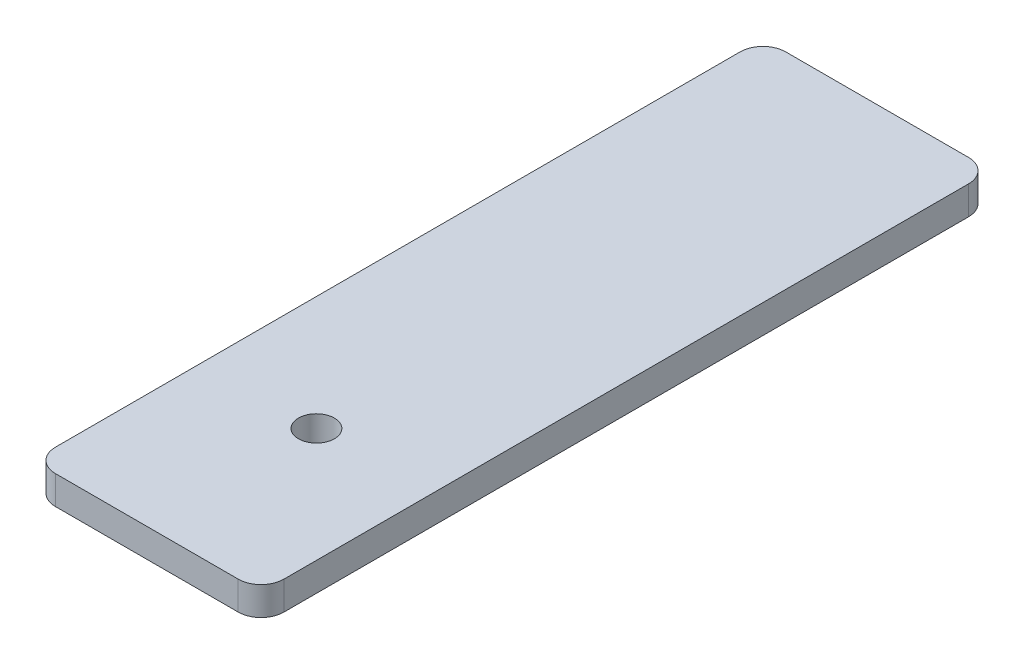
ISO-10303-21;
HEADER;
FILE_DESCRIPTION(('STEP AP214'),'2;1');
FILE_NAME('part.step','',(''),(''),'','','');
FILE_SCHEMA(('AUTOMOTIVE_DESIGN { 1 0 10303 214 1 1 1 1 }'));
ENDSEC;
DATA;
#1=APPLICATION_CONTEXT('core data for automotive mechanical design processes');
#2=APPLICATION_PROTOCOL_DEFINITION('international standard','automotive_design',2000,#1);
#3=PRODUCT_CONTEXT('',#1,'mechanical');
#4=PRODUCT('Part','Part','',(#3));
#5=PRODUCT_RELATED_PRODUCT_CATEGORY('part','',(#4));
#6=PRODUCT_DEFINITION_FORMATION('','',#4);
#7=PRODUCT_DEFINITION_CONTEXT('part definition',#1,'design');
#8=PRODUCT_DEFINITION('design','',#6,#7);
#9=PRODUCT_DEFINITION_SHAPE('','',#8);
#10=(LENGTH_UNIT() NAMED_UNIT(*) SI_UNIT(.MILLI.,.METRE.));
#11=(NAMED_UNIT(*) PLANE_ANGLE_UNIT() SI_UNIT($,.RADIAN.));
#12=(NAMED_UNIT(*) SI_UNIT($,.STERADIAN.) SOLID_ANGLE_UNIT());
#13=UNCERTAINTY_MEASURE_WITH_UNIT(LENGTH_MEASURE(1.E-05),#10,'distance_accuracy_value','');
#14=(GEOMETRIC_REPRESENTATION_CONTEXT(3) GLOBAL_UNCERTAINTY_ASSIGNED_CONTEXT((#13)) GLOBAL_UNIT_ASSIGNED_CONTEXT((#10,
#11,#12)) REPRESENTATION_CONTEXT('',''));
#15=CARTESIAN_POINT('',(0.,0.,0.));
#16=DIRECTION('',(0.,0.,1.));
#17=DIRECTION('',(1.,0.,0.));
#18=AXIS2_PLACEMENT_3D('',#15,#16,#17);
#19=CARTESIAN_POINT('',(-26.2810810810811,3.175,24.9587837837838));
#20=DIRECTION('',(1.,0.,0.));
#21=DIRECTION('',(0.,0.,-1.));
#22=AXIS2_PLACEMENT_3D('',#19,#20,#21);
#23=PLANE('',#22);
#24=DIRECTION('',(0.,0.,1.));
#25=VECTOR('',#24,1.);
#26=CARTESIAN_POINT('',(-26.2810810810811,3.175,24.9587837837838));
#27=LINE('',#26,#25);
#28=CARTESIAN_POINT('',(-26.2810810810811,3.175,-53.6762162162162));
#29=VERTEX_POINT('',#28);
#30=CARTESIAN_POINT('',(-26.2810810810811,3.175,22.4187837837838));
#31=VERTEX_POINT('',#30);
#32=EDGE_CURVE('E125',#29,#31,#27,.T.);
#33=ORIENTED_EDGE('',*,*,#32,.F.);
#34=DIRECTION('',(0.,-1.,0.));
#35=VECTOR('',#34,1.);
#36=CARTESIAN_POINT('',(-26.2810810810811,3.175,-53.6762162162162));
#37=LINE('',#36,#35);
#38=CARTESIAN_POINT('',(-26.2810810810811,0.,-53.6762162162162));
#39=VERTEX_POINT('',#38);
#40=EDGE_CURVE('E110',#29,#39,#37,.T.);
#41=ORIENTED_EDGE('',*,*,#40,.T.);
#42=DIRECTION('',(0.,0.,1.));
#43=VECTOR('',#42,1.);
#44=CARTESIAN_POINT('',(-26.2810810810811,0.,24.9587837837838));
#45=LINE('',#44,#43);
#46=CARTESIAN_POINT('',(-26.2810810810811,0.,22.4187837837838));
#47=VERTEX_POINT('',#46);
#48=EDGE_CURVE('E122',#39,#47,#45,.T.);
#49=ORIENTED_EDGE('',*,*,#48,.T.);
#50=DIRECTION('',(0.,-1.,0.));
#51=VECTOR('',#50,1.);
#52=CARTESIAN_POINT('',(-26.2810810810811,3.175,22.4187837837838));
#53=LINE('',#52,#51);
#54=EDGE_CURVE('E127',#47,#31,#53,.F.);
#55=ORIENTED_EDGE('',*,*,#54,.T.);
#56=EDGE_LOOP('',(#33,#41,#49,#55));
#57=FACE_BOUND('',#56,.T.);
#58=ADVANCED_FACE('F40',(#57),#23,.F.);
#59=CARTESIAN_POINT('',(-26.2810810810811,3.175,24.9587837837838));
#60=DIRECTION('',(0.,0.,-1.));
#61=DIRECTION('',(-1.,0.,0.));
#62=AXIS2_PLACEMENT_3D('',#59,#60,#61);
#63=PLANE('',#62);
#64=DIRECTION('',(1.,0.,0.));
#65=VECTOR('',#64,1.);
#66=CARTESIAN_POINT('',(-26.2810810810811,0.,24.9587837837838));
#67=LINE('',#66,#65);
#68=CARTESIAN_POINT('',(-23.7410810810811,0.,24.9587837837838));
#69=VERTEX_POINT('',#68);
#70=CARTESIAN_POINT('',(-3.42108108108108,0.,24.9587837837838));
#71=VERTEX_POINT('',#70);
#72=EDGE_CURVE('E131',#69,#71,#67,.T.);
#73=ORIENTED_EDGE('',*,*,#72,.T.);
#74=DIRECTION('',(0.,-1.,0.));
#75=VECTOR('',#74,1.);
#76=CARTESIAN_POINT('',(-3.42108108108108,3.175,24.9587837837838));
#77=LINE('',#76,#75);
#78=CARTESIAN_POINT('',(-3.42108108108108,3.175,24.9587837837838));
#79=VERTEX_POINT('',#78);
#80=EDGE_CURVE('E11',#71,#79,#77,.F.);
#81=ORIENTED_EDGE('',*,*,#80,.T.);
#82=DIRECTION('',(1.,0.,0.));
#83=VECTOR('',#82,1.);
#84=CARTESIAN_POINT('',(-26.2810810810811,3.175,24.9587837837838));
#85=LINE('',#84,#83);
#86=CARTESIAN_POINT('',(-23.7410810810811,3.175,24.9587837837838));
#87=VERTEX_POINT('',#86);
#88=EDGE_CURVE('E171',#87,#79,#85,.T.);
#89=ORIENTED_EDGE('',*,*,#88,.F.);
#90=DIRECTION('',(0.,-1.,0.));
#91=VECTOR('',#90,1.);
#92=CARTESIAN_POINT('',(-23.7410810810811,3.175,24.9587837837838));
#93=LINE('',#92,#91);
#94=EDGE_CURVE('E48',#87,#69,#93,.T.);
#95=ORIENTED_EDGE('',*,*,#94,.T.);
#96=EDGE_LOOP('',(#73,#81,#89,#95));
#97=FACE_BOUND('',#96,.T.);
#98=ADVANCED_FACE('F169',(#97),#63,.F.);
#99=CARTESIAN_POINT('',(-0.881081081081075,3.175,24.9587837837838));
#100=DIRECTION('',(-1.,0.,0.));
#101=DIRECTION('',(0.,0.,1.));
#102=AXIS2_PLACEMENT_3D('',#99,#100,#101);
#103=PLANE('',#102);
#104=DIRECTION('',(0.,0.,-1.));
#105=VECTOR('',#104,1.);
#106=CARTESIAN_POINT('',(-0.881081081081075,0.,24.9587837837838));
#107=LINE('',#106,#105);
#108=CARTESIAN_POINT('',(-0.881081081081075,0.,22.4187837837838));
#109=VERTEX_POINT('',#108);
#110=CARTESIAN_POINT('',(-0.881081081081078,0.,-53.6762162162162));
#111=VERTEX_POINT('',#110);
#112=EDGE_CURVE('E135',#109,#111,#107,.T.);
#113=ORIENTED_EDGE('',*,*,#112,.T.);
#114=DIRECTION('',(0.,-1.,0.));
#115=VECTOR('',#114,1.);
#116=CARTESIAN_POINT('',(-0.881081081081078,3.175,-53.6762162162162));
#117=LINE('',#116,#115);
#118=CARTESIAN_POINT('',(-0.881081081081078,3.175,-53.6762162162162));
#119=VERTEX_POINT('',#118);
#120=EDGE_CURVE('E55',#111,#119,#117,.F.);
#121=ORIENTED_EDGE('',*,*,#120,.T.);
#122=DIRECTION('',(0.,0.,-1.));
#123=VECTOR('',#122,1.);
#124=CARTESIAN_POINT('',(-0.881081081081075,3.175,24.9587837837838));
#125=LINE('',#124,#123);
#126=CARTESIAN_POINT('',(-0.881081081081075,3.175,22.4187837837838));
#127=VERTEX_POINT('',#126);
#128=EDGE_CURVE('E179',#127,#119,#125,.T.);
#129=ORIENTED_EDGE('',*,*,#128,.F.);
#130=DIRECTION('',(0.,-1.,0.));
#131=VECTOR('',#130,1.);
#132=CARTESIAN_POINT('',(-0.881081081081075,3.175,22.4187837837838));
#133=LINE('',#132,#131);
#134=EDGE_CURVE('E162',#127,#109,#133,.T.);
#135=ORIENTED_EDGE('',*,*,#134,.T.);
#136=EDGE_LOOP('',(#113,#121,#129,#135));
#137=FACE_BOUND('',#136,.T.);
#138=ADVANCED_FACE('F178',(#137),#103,.F.);
#139=CARTESIAN_POINT('',(-26.2810810810811,3.175,-56.2162162162162));
#140=DIRECTION('',(0.,0.,1.));
#141=DIRECTION('',(1.,0.,0.));
#142=AXIS2_PLACEMENT_3D('',#139,#140,#141);
#143=PLANE('',#142);
#144=DIRECTION('',(-1.,0.,0.));
#145=VECTOR('',#144,1.);
#146=CARTESIAN_POINT('',(-26.2810810810811,0.,-56.2162162162162));
#147=LINE('',#146,#145);
#148=CARTESIAN_POINT('',(-3.42108108108108,0.,-56.2162162162162));
#149=VERTEX_POINT('',#148);
#150=CARTESIAN_POINT('',(-23.7410810810811,0.,-56.2162162162162));
#151=VERTEX_POINT('',#150);
#152=EDGE_CURVE('E145',#149,#151,#147,.T.);
#153=ORIENTED_EDGE('',*,*,#152,.T.);
#154=DIRECTION('',(0.,-1.,0.));
#155=VECTOR('',#154,1.);
#156=CARTESIAN_POINT('',(-23.7410810810811,3.175,-56.2162162162162));
#157=LINE('',#156,#155);
#158=CARTESIAN_POINT('',(-23.7410810810811,3.175,-56.2162162162162));
#159=VERTEX_POINT('',#158);
#160=EDGE_CURVE('E111',#151,#159,#157,.F.);
#161=ORIENTED_EDGE('',*,*,#160,.T.);
#162=DIRECTION('',(-1.,0.,0.));
#163=VECTOR('',#162,1.);
#164=CARTESIAN_POINT('',(-26.2810810810811,3.175,-56.2162162162162));
#165=LINE('',#164,#163);
#166=CARTESIAN_POINT('',(-3.42108108108108,3.175,-56.2162162162162));
#167=VERTEX_POINT('',#166);
#168=EDGE_CURVE('E141',#167,#159,#165,.T.);
#169=ORIENTED_EDGE('',*,*,#168,.F.);
#170=DIRECTION('',(0.,-1.,0.));
#171=VECTOR('',#170,1.);
#172=CARTESIAN_POINT('',(-3.42108108108108,3.175,-56.2162162162162));
#173=LINE('',#172,#171);
#174=EDGE_CURVE('E116',#167,#149,#173,.T.);
#175=ORIENTED_EDGE('',*,*,#174,.T.);
#176=EDGE_LOOP('',(#153,#161,#169,#175));
#177=FACE_BOUND('',#176,.T.);
#178=ADVANCED_FACE('F192',(#177),#143,.F.);
#179=CARTESIAN_POINT('',(0.,3.175,0.));
#180=DIRECTION('',(0.,-1.,0.));
#181=DIRECTION('',(0.,0.,-1.));
#182=AXIS2_PLACEMENT_3D('',#179,#180,#181);
#183=PLANE('',#182);
#184=CARTESIAN_POINT('',(-13.5810810810811,3.175,6.10878378378378));
#185=DIRECTION('',(0.,1.,0.));
#186=DIRECTION('',(0.,0.,1.));
#187=AXIS2_PLACEMENT_3D('',#184,#185,#186);
#188=CIRCLE('',#187,2.);
#189=CARTESIAN_POINT('',(-13.5810810810811,3.175,8.10878378378378));
#190=VERTEX_POINT('',#189);
#191=EDGE_CURVE('E138',#190,#190,#188,.T.);
#192=ORIENTED_EDGE('',*,*,#191,.F.);
#193=EDGE_LOOP('',(#192));
#194=FACE_BOUND('',#193,.T.);
#195=ORIENTED_EDGE('',*,*,#168,.T.);
#196=CARTESIAN_POINT('',(-23.7410810810811,3.175,-53.6762162162162));
#197=DIRECTION('',(0.,-1.,0.));
#198=DIRECTION('',(0.,0.,-1.));
#199=AXIS2_PLACEMENT_3D('',#196,#197,#198);
#200=CIRCLE('',#199,2.54);
#201=EDGE_CURVE('E160',#159,#29,#200,.F.);
#202=ORIENTED_EDGE('',*,*,#201,.T.);
#203=ORIENTED_EDGE('',*,*,#32,.T.);
#204=CARTESIAN_POINT('',(-23.7410810810811,3.175,22.4187837837838));
#205=DIRECTION('',(0.,-1.,0.));
#206=DIRECTION('',(0.,0.,-1.));
#207=AXIS2_PLACEMENT_3D('',#204,#205,#206);
#208=CIRCLE('',#207,2.54);
#209=EDGE_CURVE('E155',#31,#87,#208,.F.);
#210=ORIENTED_EDGE('',*,*,#209,.T.);
#211=ORIENTED_EDGE('',*,*,#88,.T.);
#212=CARTESIAN_POINT('',(-3.42108108108107,3.175,22.4187837837838));
#213=DIRECTION('',(0.,-1.,0.));
#214=DIRECTION('',(0.,0.,-1.));
#215=AXIS2_PLACEMENT_3D('',#212,#213,#214);
#216=CIRCLE('',#215,2.54);
#217=EDGE_CURVE('E62',#79,#127,#216,.F.);
#218=ORIENTED_EDGE('',*,*,#217,.T.);
#219=ORIENTED_EDGE('',*,*,#128,.T.);
#220=CARTESIAN_POINT('',(-3.42108108108108,3.175,-53.6762162162162));
#221=DIRECTION('',(0.,-1.,0.));
#222=DIRECTION('',(0.,0.,-1.));
#223=AXIS2_PLACEMENT_3D('',#220,#221,#222);
#224=CIRCLE('',#223,2.54);
#225=EDGE_CURVE('E158',#119,#167,#224,.F.);
#226=ORIENTED_EDGE('',*,*,#225,.T.);
#227=EDGE_LOOP('',(#195,#202,#203,#210,#211,#218,#219,#226));
#228=FACE_BOUND('',#227,.T.);
#229=ADVANCED_FACE('F190',(#194,#228),#183,.F.);
#230=CARTESIAN_POINT('',(0.,0.,0.));
#231=DIRECTION('',(0.,-1.,0.));
#232=DIRECTION('',(0.,0.,-1.));
#233=AXIS2_PLACEMENT_3D('',#230,#231,#232);
#234=PLANE('',#233);
#235=CARTESIAN_POINT('',(-13.5810810810811,0.,6.10878378378378));
#236=DIRECTION('',(0.,1.,0.));
#237=DIRECTION('',(0.,0.,1.));
#238=AXIS2_PLACEMENT_3D('',#235,#236,#237);
#239=CIRCLE('',#238,2.);
#240=CARTESIAN_POINT('',(-13.5810810810811,0.,8.10878378378378));
#241=VERTEX_POINT('',#240);
#242=EDGE_CURVE('E132',#241,#241,#239,.T.);
#243=ORIENTED_EDGE('',*,*,#242,.T.);
#244=EDGE_LOOP('',(#243));
#245=FACE_BOUND('',#244,.T.);
#246=ORIENTED_EDGE('',*,*,#48,.F.);
#247=CARTESIAN_POINT('',(-23.7410810810811,0.,-53.6762162162162));
#248=DIRECTION('',(0.,-1.,0.));
#249=DIRECTION('',(0.,0.,-1.));
#250=AXIS2_PLACEMENT_3D('',#247,#248,#249);
#251=CIRCLE('',#250,2.54);
#252=EDGE_CURVE('E106',#39,#151,#251,.T.);
#253=ORIENTED_EDGE('',*,*,#252,.T.);
#254=ORIENTED_EDGE('',*,*,#152,.F.);
#255=CARTESIAN_POINT('',(-3.42108108108108,0.,-53.6762162162162));
#256=DIRECTION('',(0.,-1.,0.));
#257=DIRECTION('',(0.,0.,-1.));
#258=AXIS2_PLACEMENT_3D('',#255,#256,#257);
#259=CIRCLE('',#258,2.54);
#260=EDGE_CURVE('E117',#149,#111,#259,.T.);
#261=ORIENTED_EDGE('',*,*,#260,.T.);
#262=ORIENTED_EDGE('',*,*,#112,.F.);
#263=CARTESIAN_POINT('',(-3.42108108108107,0.,22.4187837837838));
#264=DIRECTION('',(0.,-1.,0.));
#265=DIRECTION('',(0.,0.,-1.));
#266=AXIS2_PLACEMENT_3D('',#263,#264,#265);
#267=CIRCLE('',#266,2.54);
#268=EDGE_CURVE('E149',#109,#71,#267,.T.);
#269=ORIENTED_EDGE('',*,*,#268,.T.);
#270=ORIENTED_EDGE('',*,*,#72,.F.);
#271=CARTESIAN_POINT('',(-23.7410810810811,0.,22.4187837837838));
#272=DIRECTION('',(0.,-1.,0.));
#273=DIRECTION('',(0.,0.,-1.));
#274=AXIS2_PLACEMENT_3D('',#271,#272,#273);
#275=CIRCLE('',#274,2.54);
#276=EDGE_CURVE('E126',#69,#47,#275,.T.);
#277=ORIENTED_EDGE('',*,*,#276,.T.);
#278=EDGE_LOOP('',(#246,#253,#254,#261,#262,#269,#270,#277));
#279=FACE_BOUND('',#278,.T.);
#280=ADVANCED_FACE('F129',(#245,#279),#234,.T.);
#281=CARTESIAN_POINT('',(-13.5810810810811,0.,6.10878378378378));
#282=DIRECTION('',(0.,1.,0.));
#283=DIRECTION('',(0.,0.,1.));
#284=AXIS2_PLACEMENT_3D('',#281,#282,#283);
#285=CYLINDRICAL_SURFACE('',#284,2.);
#286=ORIENTED_EDGE('',*,*,#242,.F.);
#287=EDGE_LOOP('',(#286));
#288=FACE_BOUND('',#287,.T.);
#289=ORIENTED_EDGE('',*,*,#191,.T.);
#290=EDGE_LOOP('',(#289));
#291=FACE_BOUND('',#290,.T.);
#292=ADVANCED_FACE('F188',(#288,#291),#285,.F.);
#293=CARTESIAN_POINT('',(-23.7410810810811,3.175,-53.6762162162162));
#294=DIRECTION('',(0.,-1.,0.));
#295=DIRECTION('',(0.,0.,-1.));
#296=AXIS2_PLACEMENT_3D('',#293,#294,#295);
#297=CYLINDRICAL_SURFACE('',#296,2.54);
#298=ORIENTED_EDGE('',*,*,#201,.F.);
#299=ORIENTED_EDGE('',*,*,#160,.F.);
#300=ORIENTED_EDGE('',*,*,#252,.F.);
#301=ORIENTED_EDGE('',*,*,#40,.F.);
#302=EDGE_LOOP('',(#298,#299,#300,#301));
#303=FACE_BOUND('',#302,.T.);
#304=ADVANCED_FACE('F109',(#303),#297,.T.);
#305=CARTESIAN_POINT('',(-3.42108108108108,3.175,-53.6762162162162));
#306=DIRECTION('',(0.,-1.,0.));
#307=DIRECTION('',(0.,0.,-1.));
#308=AXIS2_PLACEMENT_3D('',#305,#306,#307);
#309=CYLINDRICAL_SURFACE('',#308,2.54);
#310=ORIENTED_EDGE('',*,*,#225,.F.);
#311=ORIENTED_EDGE('',*,*,#120,.F.);
#312=ORIENTED_EDGE('',*,*,#260,.F.);
#313=ORIENTED_EDGE('',*,*,#174,.F.);
#314=EDGE_LOOP('',(#310,#311,#312,#313));
#315=FACE_BOUND('',#314,.T.);
#316=ADVANCED_FACE('F198',(#315),#309,.T.);
#317=CARTESIAN_POINT('',(-3.42108108108107,3.175,22.4187837837838));
#318=DIRECTION('',(0.,-1.,0.));
#319=DIRECTION('',(0.,0.,-1.));
#320=AXIS2_PLACEMENT_3D('',#317,#318,#319);
#321=CYLINDRICAL_SURFACE('',#320,2.54);
#322=ORIENTED_EDGE('',*,*,#217,.F.);
#323=ORIENTED_EDGE('',*,*,#80,.F.);
#324=ORIENTED_EDGE('',*,*,#268,.F.);
#325=ORIENTED_EDGE('',*,*,#134,.F.);
#326=EDGE_LOOP('',(#322,#323,#324,#325));
#327=FACE_BOUND('',#326,.T.);
#328=ADVANCED_FACE('F177',(#327),#321,.T.);
#329=CARTESIAN_POINT('',(-23.7410810810811,3.175,22.4187837837838));
#330=DIRECTION('',(0.,-1.,0.));
#331=DIRECTION('',(0.,0.,-1.));
#332=AXIS2_PLACEMENT_3D('',#329,#330,#331);
#333=CYLINDRICAL_SURFACE('',#332,2.54);
#334=ORIENTED_EDGE('',*,*,#209,.F.);
#335=ORIENTED_EDGE('',*,*,#54,.F.);
#336=ORIENTED_EDGE('',*,*,#276,.F.);
#337=ORIENTED_EDGE('',*,*,#94,.F.);
#338=EDGE_LOOP('',(#334,#335,#336,#337));
#339=FACE_BOUND('',#338,.T.);
#340=ADVANCED_FACE('F42',(#339),#333,.T.);
#341=CLOSED_SHELL('',(#58,#98,#138,#178,#229,#280,#292,#304,#316,#328,#340));
#342=MANIFOLD_SOLID_BREP('B2',#341);
#343=ADVANCED_BREP_SHAPE_REPRESENTATION('',(#18,#342),#14);
#344=SHAPE_DEFINITION_REPRESENTATION(#9,#343);
ENDSEC;
END-ISO-10303-21;
